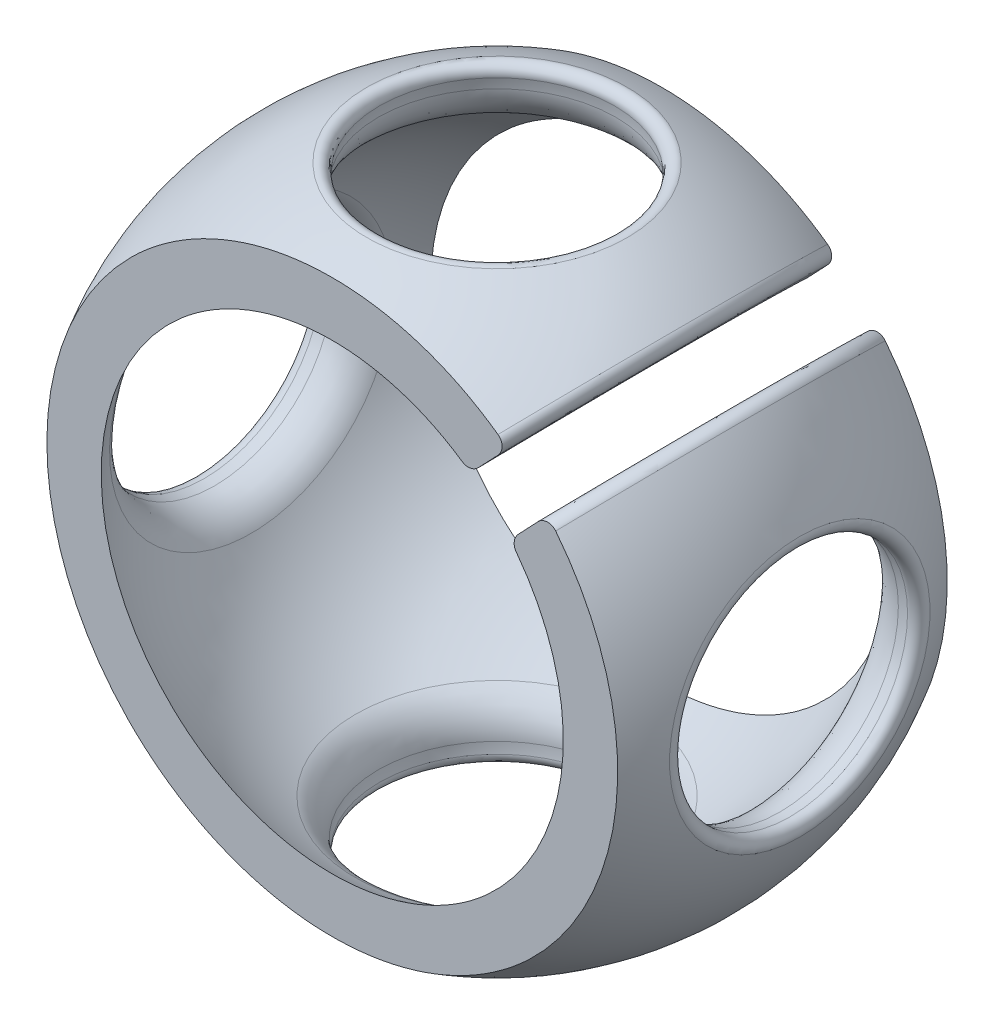
ISO-10303-21;
HEADER;
FILE_DESCRIPTION(('STEP AP214'),'2;1');
FILE_NAME('part.step','',(''),(''),'','','');
FILE_SCHEMA(('AUTOMOTIVE_DESIGN { 1 0 10303 214 1 1 1 1 }'));
ENDSEC;
DATA;
#1=APPLICATION_CONTEXT('core data for automotive mechanical design processes');
#2=APPLICATION_PROTOCOL_DEFINITION('international standard','automotive_design',2000,#1);
#3=PRODUCT_CONTEXT('',#1,'mechanical');
#4=PRODUCT('Part','Part','',(#3));
#5=PRODUCT_RELATED_PRODUCT_CATEGORY('part','',(#4));
#6=PRODUCT_DEFINITION_FORMATION('','',#4);
#7=PRODUCT_DEFINITION_CONTEXT('part definition',#1,'design');
#8=PRODUCT_DEFINITION('design','',#6,#7);
#9=PRODUCT_DEFINITION_SHAPE('','',#8);
#10=(LENGTH_UNIT() NAMED_UNIT(*) SI_UNIT(.MILLI.,.METRE.));
#11=(NAMED_UNIT(*) PLANE_ANGLE_UNIT() SI_UNIT($,.RADIAN.));
#12=(NAMED_UNIT(*) SI_UNIT($,.STERADIAN.) SOLID_ANGLE_UNIT());
#13=UNCERTAINTY_MEASURE_WITH_UNIT(LENGTH_MEASURE(1.E-05),#10,'distance_accuracy_value','');
#14=(GEOMETRIC_REPRESENTATION_CONTEXT(3) GLOBAL_UNCERTAINTY_ASSIGNED_CONTEXT((#13)) GLOBAL_UNIT_ASSIGNED_CONTEXT((#10,
#11,#12)) REPRESENTATION_CONTEXT('',''));
#15=CARTESIAN_POINT('',(0.,0.,0.));
#16=DIRECTION('',(0.,0.,1.));
#17=DIRECTION('',(1.,0.,0.));
#18=AXIS2_PLACEMENT_3D('',#15,#16,#17);
#19=CARTESIAN_POINT('',(0.,0.,0.));
#20=DIRECTION('',(0.,1.,0.));
#21=DIRECTION('',(1.,0.,0.));
#22=AXIS2_PLACEMENT_3D('',#19,#20,#21);
#23=SPHERICAL_SURFACE('',#22,7.75);
#24=CARTESIAN_POINT('',(6.71666666666667,0.,0.));
#25=DIRECTION('',(-1.,0.,0.));
#26=DIRECTION('',(0.,-1.,0.));
#27=AXIS2_PLACEMENT_3D('',#24,#25,#26);
#28=CIRCLE('',#27,3.86637929966641);
#29=CARTESIAN_POINT('',(6.71666666666667,-3.86637929966641,0.));
#30=VERTEX_POINT('',#29);
#31=EDGE_CURVE('E248',#30,#30,#28,.F.);
#32=ORIENTED_EDGE('',*,*,#31,.T.);
#33=EDGE_LOOP('',(#32));
#34=FACE_BOUND('',#33,.T.);
#35=CARTESIAN_POINT('',(-6.71666666666667,0.,0.));
#36=DIRECTION('',(1.,0.,0.));
#37=DIRECTION('',(0.,1.,0.));
#38=AXIS2_PLACEMENT_3D('',#35,#36,#37);
#39=CIRCLE('',#38,3.86637929966641);
#40=CARTESIAN_POINT('',(-6.71666666666667,3.86637929966641,0.));
#41=VERTEX_POINT('',#40);
#42=EDGE_CURVE('E244',#41,#41,#39,.F.);
#43=ORIENTED_EDGE('',*,*,#42,.T.);
#44=EDGE_LOOP('',(#43));
#45=FACE_BOUND('',#44,.T.);
#46=CARTESIAN_POINT('',(0.,-6.71666666666667,0.));
#47=DIRECTION('',(0.,1.,0.));
#48=DIRECTION('',(-1.,0.,0.));
#49=AXIS2_PLACEMENT_3D('',#46,#47,#48);
#50=CIRCLE('',#49,3.86637929966641);
#51=CARTESIAN_POINT('',(-3.86637929966641,-6.71666666666667,0.));
#52=VERTEX_POINT('',#51);
#53=EDGE_CURVE('E240',#52,#52,#50,.F.);
#54=ORIENTED_EDGE('',*,*,#53,.T.);
#55=EDGE_LOOP('',(#54));
#56=FACE_BOUND('',#55,.T.);
#57=CARTESIAN_POINT('',(0.,6.71666666666667,0.));
#58=DIRECTION('',(0.,-1.,0.));
#59=DIRECTION('',(1.,0.,0.));
#60=AXIS2_PLACEMENT_3D('',#57,#58,#59);
#61=CIRCLE('',#60,3.86637929966641);
#62=CARTESIAN_POINT('',(3.86637929966641,6.71666666666667,0.));
#63=VERTEX_POINT('',#62);
#64=EDGE_CURVE('E236',#63,#63,#61,.F.);
#65=ORIENTED_EDGE('',*,*,#64,.T.);
#66=EDGE_LOOP('',(#65));
#67=FACE_BOUND('',#66,.T.);
#68=CARTESIAN_POINT('',(0.,0.,4.5));
#69=DIRECTION('',(0.,0.,1.));
#70=DIRECTION('',(1.,0.,0.));
#71=AXIS2_PLACEMENT_3D('',#68,#69,#70);
#72=CIRCLE('',#71,6.30971473206198);
#73=CARTESIAN_POINT('',(5.02078799919602,3.82154260307657,4.5));
#74=VERTEX_POINT('',#73);
#75=CARTESIAN_POINT('',(3.55438310296655,5.21333489786968,4.5));
#76=VERTEX_POINT('',#75);
#77=EDGE_CURVE('E124',#74,#76,#72,.F.);
#78=ORIENTED_EDGE('',*,*,#77,.F.);
#79=CARTESIAN_POINT('',(0.733202448114739,-0.69589614739656,0.));
#80=DIRECTION('',(-0.725318550823175,0.688413393123471,0.));
#81=DIRECTION('',(-0.688413393123471,-0.725318550823175,0.));
#82=AXIS2_PLACEMENT_3D('',#79,#80,#81);
#83=CIRCLE('',#82,7.6837909082768);
#84=CARTESIAN_POINT('',(5.02078799919602,3.82154260307657,-4.5));
#85=VERTEX_POINT('',#84);
#86=EDGE_CURVE('E138',#74,#85,#83,.T.);
#87=ORIENTED_EDGE('',*,*,#86,.T.);
#88=CARTESIAN_POINT('',(0.,0.,-4.5));
#89=DIRECTION('',(0.,0.,1.));
#90=DIRECTION('',(1.,0.,0.));
#91=AXIS2_PLACEMENT_3D('',#88,#89,#90);
#92=CIRCLE('',#91,6.30971473206198);
#93=CARTESIAN_POINT('',(3.55438310296655,5.21333489786968,-4.5));
#94=VERTEX_POINT('',#93);
#95=EDGE_CURVE('E143',#85,#94,#92,.F.);
#96=ORIENTED_EDGE('',*,*,#95,.T.);
#97=CARTESIAN_POINT('',(-0.733202448114734,0.695896147396554,0.));
#98=DIRECTION('',(0.725318550823175,-0.688413393123471,0.));
#99=DIRECTION('',(0.688413393123471,0.725318550823175,0.));
#100=AXIS2_PLACEMENT_3D('',#97,#98,#99);
#101=CIRCLE('',#100,7.6837909082768);
#102=EDGE_CURVE('E141',#94,#76,#101,.T.);
#103=ORIENTED_EDGE('',*,*,#102,.T.);
#104=EDGE_LOOP('',(#78,#87,#96,#103));
#105=FACE_BOUND('',#104,.T.);
#106=ADVANCED_FACE('F55',(#34,#45,#56,#67,#105),#23,.F.);
#107=CARTESIAN_POINT('',(0.,0.,0.));
#108=DIRECTION('',(0.,1.,0.));
#109=DIRECTION('',(1.,0.,0.));
#110=AXIS2_PLACEMENT_3D('',#107,#108,#109);
#111=SPHERICAL_SURFACE('',#110,9.);
#112=CARTESIAN_POINT('',(0.,8.26714285714286,0.));
#113=DIRECTION('',(0.,-1.,0.));
#114=DIRECTION('',(1.,0.,0.));
#115=AXIS2_PLACEMENT_3D('',#112,#113,#114);
#116=CIRCLE('',#115,3.55729517746164);
#117=CARTESIAN_POINT('',(3.55729517746164,8.26714285714286,0.));
#118=VERTEX_POINT('',#117);
#119=EDGE_CURVE('E404',#118,#118,#116,.T.);
#120=ORIENTED_EDGE('',*,*,#119,.T.);
#121=EDGE_LOOP('',(#120));
#122=FACE_BOUND('',#121,.T.);
#123=CARTESIAN_POINT('',(-8.26714285714286,0.,0.));
#124=DIRECTION('',(1.,0.,0.));
#125=DIRECTION('',(0.,1.,0.));
#126=AXIS2_PLACEMENT_3D('',#123,#124,#125);
#127=CIRCLE('',#126,3.55729517746164);
#128=CARTESIAN_POINT('',(-8.26714285714286,3.55729517746164,0.));
#129=VERTEX_POINT('',#128);
#130=EDGE_CURVE('E409',#129,#129,#127,.T.);
#131=ORIENTED_EDGE('',*,*,#130,.T.);
#132=EDGE_LOOP('',(#131));
#133=FACE_BOUND('',#132,.T.);
#134=CARTESIAN_POINT('',(0.,-8.26714285714286,0.));
#135=DIRECTION('',(0.,1.,0.));
#136=DIRECTION('',(-1.,0.,0.));
#137=AXIS2_PLACEMENT_3D('',#134,#135,#136);
#138=CIRCLE('',#137,3.55729517746164);
#139=CARTESIAN_POINT('',(-3.55729517746164,-8.26714285714286,0.));
#140=VERTEX_POINT('',#139);
#141=EDGE_CURVE('E386',#140,#140,#138,.T.);
#142=ORIENTED_EDGE('',*,*,#141,.T.);
#143=EDGE_LOOP('',(#142));
#144=FACE_BOUND('',#143,.T.);
#145=CARTESIAN_POINT('',(8.26714285714286,0.,0.));
#146=DIRECTION('',(-1.,0.,0.));
#147=DIRECTION('',(0.,-1.,0.));
#148=AXIS2_PLACEMENT_3D('',#145,#146,#147);
#149=CIRCLE('',#148,3.55729517746164);
#150=CARTESIAN_POINT('',(8.26714285714286,-3.55729517746165,0.));
#151=VERTEX_POINT('',#150);
#152=EDGE_CURVE('E382',#151,#151,#149,.T.);
#153=ORIENTED_EDGE('',*,*,#152,.T.);
#154=EDGE_LOOP('',(#153));
#155=FACE_BOUND('',#154,.T.);
#156=CARTESIAN_POINT('',(0.,0.,4.5));
#157=DIRECTION('',(0.,0.,1.));
#158=DIRECTION('',(1.,0.,0.));
#159=AXIS2_PLACEMENT_3D('',#156,#157,#158);
#160=CIRCLE('',#159,7.79422863405995);
#161=CARTESIAN_POINT('',(6.10113789721775,4.85037280620093,4.5));
#162=VERTEX_POINT('',#161);
#163=CARTESIAN_POINT('',(4.52544587301567,6.34589155677951,4.5));
#164=VERTEX_POINT('',#163);
#165=EDGE_CURVE('E334',#162,#164,#160,.F.);
#166=ORIENTED_EDGE('',*,*,#165,.T.);
#167=CARTESIAN_POINT('',(-0.787846012101037,0.747759375289289,0.));
#168=DIRECTION('',(0.725318550823175,-0.688413393123471,0.));
#169=DIRECTION('',(0.688413393123471,0.725318550823175,0.));
#170=AXIS2_PLACEMENT_3D('',#167,#168,#169);
#171=CIRCLE('',#170,8.93421258857677);
#172=CARTESIAN_POINT('',(4.52544587301567,6.34589155677951,-4.5));
#173=VERTEX_POINT('',#172);
#174=EDGE_CURVE('E227',#164,#173,#171,.F.);
#175=ORIENTED_EDGE('',*,*,#174,.T.);
#176=CARTESIAN_POINT('',(0.,0.,-4.5));
#177=DIRECTION('',(0.,0.,1.));
#178=DIRECTION('',(1.,0.,0.));
#179=AXIS2_PLACEMENT_3D('',#176,#177,#178);
#180=CIRCLE('',#179,7.79422863405995);
#181=CARTESIAN_POINT('',(6.10113789721775,4.85037280620093,-4.5));
#182=VERTEX_POINT('',#181);
#183=EDGE_CURVE('E387',#182,#173,#180,.F.);
#184=ORIENTED_EDGE('',*,*,#183,.F.);
#185=CARTESIAN_POINT('',(0.787846012101043,-0.747759375289296,0.));
#186=DIRECTION('',(-0.725318550823175,0.688413393123471,0.));
#187=DIRECTION('',(-0.688413393123471,-0.725318550823175,0.));
#188=AXIS2_PLACEMENT_3D('',#185,#186,#187);
#189=CIRCLE('',#188,8.93421258857676);
#190=EDGE_CURVE('E131',#182,#162,#189,.F.);
#191=ORIENTED_EDGE('',*,*,#190,.T.);
#192=EDGE_LOOP('',(#166,#175,#184,#191));
#193=FACE_BOUND('',#192,.T.);
#194=ADVANCED_FACE('F176',(#122,#133,#144,#155,#193),#111,.T.);
#195=CARTESIAN_POINT('',(0.,12.5,-4.5));
#196=DIRECTION('',(0.,0.,1.));
#197=DIRECTION('',(1.,0.,0.));
#198=AXIS2_PLACEMENT_3D('',#195,#196,#197);
#199=PLANE('',#198);
#200=ORIENTED_EDGE('',*,*,#95,.F.);
#201=CARTESIAN_POINT('',(5.02078799919602,3.82154260307657,-4.5));
#202=CARTESIAN_POINT('',(5.01140973893834,3.83382565129379,-4.5));
#203=CARTESIAN_POINT('',(5.00324758314674,3.84698347736219,-4.5));
#204=CARTESIAN_POINT('',(4.98942289250893,3.87444683945307,-4.5));
#205=CARTESIAN_POINT('',(4.98374375472272,3.88874397210675,-4.5));
#206=CARTESIAN_POINT('',(4.97483744968509,3.91802274792431,-4.5));
#207=CARTESIAN_POINT('',(4.9716033004275,3.93300231143106,-4.5));
#208=CARTESIAN_POINT('',(4.96742121120854,3.96329200411203,-4.5));
#209=CARTESIAN_POINT('',(4.9664771071772,3.97860264464612,-4.5));
#210=CARTESIAN_POINT('',(4.96672483887115,4.01083209912858,-4.5));
#211=CARTESIAN_POINT('',(4.96815479689111,4.0277485713737,-4.5));
#212=CARTESIAN_POINT('',(4.97335889646006,4.06120993198714,-4.5));
#213=CARTESIAN_POINT('',(4.97713387948087,4.07775468476121,-4.5));
#214=CARTESIAN_POINT('',(4.98772117287576,4.1133323470014,-4.5));
#215=CARTESIAN_POINT('',(4.99497733161192,4.1322334599741,-4.5));
#216=CARTESIAN_POINT('',(5.012130094073,4.16878648782942,-4.5));
#217=CARTESIAN_POINT('',(5.0220274199803,4.18643805937332,-4.5));
#218=CARTESIAN_POINT('',(5.04745028260876,4.22518489837198,-4.5));
#219=CARTESIAN_POINT('',(5.06377484594357,4.24576056470473,-4.5));
#220=CARTESIAN_POINT('',(5.08177690317263,4.26474424864854,-4.5));
#221=B_SPLINE_CURVE_WITH_KNOTS('',3,(#201,#202,#203,#204,#205,#206,#207,#208,#209,#210,#211,
#212,#213,#214,#215,#216,#217,#218,#219,#220),.UNSPECIFIED.,.F.,.F.,(4,2,2,2,2,2,2,2,2,4),(0.,
0.0462303776808788,0.0921467190567898,0.137931439397152,0.18379279842972,0.234537145030331,
0.285299710892259,0.345803654542203,0.406324158951382,0.484692683883423),.UNSPECIFIED.);
#222=CARTESIAN_POINT('',(5.08177690317272,4.26474424864848,-4.5));
#223=VERTEX_POINT('',#222);
#224=EDGE_CURVE('E146',#85,#223,#221,.T.);
#225=ORIENTED_EDGE('',*,*,#224,.T.);
#226=DIRECTION('',(0.688413393123471,0.725318550823175,0.));
#227=VECTOR('',#226,1.);
#228=CARTESIAN_POINT('',(6.78547647146214,6.05977745726027,-4.5));
#229=LINE('',#228,#227);
#230=CARTESIAN_POINT('',(5.61855762664948,4.83030125313307,-4.5));
#231=VERTEX_POINT('',#230);
#232=EDGE_CURVE('E329',#223,#231,#229,.T.);
#233=ORIENTED_EDGE('',*,*,#232,.T.);
#234=CARTESIAN_POINT('',(5.61855762664948,4.83030125313307,-4.5));
#235=CARTESIAN_POINT('',(5.63610139294097,4.84879702015645,-4.5));
#236=CARTESIAN_POINT('',(5.65540979968482,4.86568829064156,-4.5));
#237=CARTESIAN_POINT('',(5.69701789545886,4.89561512617583,-4.5));
#238=CARTESIAN_POINT('',(5.71933804280176,4.90862217225791,-4.5));
#239=CARTESIAN_POINT('',(5.76330264369263,4.92855124263948,-4.5));
#240=CARTESIAN_POINT('',(5.78469700526391,4.93602223395943,-4.5));
#241=CARTESIAN_POINT('',(5.82847282206717,4.94668029731862,-4.5));
#242=CARTESIAN_POINT('',(5.85084989437941,4.94988472134227,-4.5));
#243=CARTESIAN_POINT('',(5.88981862921563,4.95130578670816,-4.5));
#244=CARTESIAN_POINT('',(5.90637350862195,4.95061833940586,-4.5));
#245=CARTESIAN_POINT('',(5.93915221025394,4.94650313274995,-4.5));
#246=CARTESIAN_POINT('',(5.95537607477731,4.94307572579124,-4.5));
#247=CARTESIAN_POINT('',(5.98705166235491,4.9333832635681,-4.5));
#248=CARTESIAN_POINT('',(6.0024989930755,4.92710372857028,-4.5));
#249=CARTESIAN_POINT('',(6.03195161007087,4.91177721542311,-4.5));
#250=CARTESIAN_POINT('',(6.04595843702096,4.90273323597383,-4.5));
#251=CARTESIAN_POINT('',(6.06677530552557,4.88627110860097,-4.5));
#252=CARTESIAN_POINT('',(6.07422535961328,4.87964631571378,-4.5));
#253=CARTESIAN_POINT('',(6.08831131977474,4.86559219046276,-4.5));
#254=CARTESIAN_POINT('',(6.09494788112451,4.85816351483813,-4.5));
#255=CARTESIAN_POINT('',(6.10113789721868,4.85037280620211,-4.5));
#256=B_SPLINE_CURVE_WITH_KNOTS('',3,(#234,#235,#236,#237,#238,#239,#240,#241,#242,#243,#244,
#245,#246,#247,#248,#249,#250,#251,#252,#253,#254,#255),.UNSPECIFIED.,.F.,.F.,(4,2,2,2,2,2,2,2,
2,2,4),(0.,0.0764556199619205,0.153459523688465,0.221063891462657,0.288392466092669,
0.337895755955597,0.387392680067399,0.437143749407346,0.486841042206323,0.51668911828632,
0.546512991222408),.UNSPECIFIED.);
#257=EDGE_CURVE('E152',#231,#182,#256,.T.);
#258=ORIENTED_EDGE('',*,*,#257,.T.);
#259=ORIENTED_EDGE('',*,*,#183,.T.);
#260=CARTESIAN_POINT('',(4.52544587301567,6.34589155677951,-4.5));
#261=CARTESIAN_POINT('',(4.53758830535816,6.33726074613841,-4.5));
#262=CARTESIAN_POINT('',(4.5489582350627,6.32755971964251,-4.5));
#263=CARTESIAN_POINT('',(4.56984652756651,6.3063961841416,-4.5));
#264=CARTESIAN_POINT('',(4.57937076847616,6.29493948252598,-4.5));
#265=CARTESIAN_POINT('',(4.59634362986764,6.2705826703584,-4.5));
#266=CARTESIAN_POINT('',(4.60379216671889,6.25768250167817,-4.5));
#267=CARTESIAN_POINT('',(4.61648807033916,6.23084176185755,-4.5));
#268=CARTESIAN_POINT('',(4.62173457314135,6.21690078487868,-4.5));
#269=CARTESIAN_POINT('',(4.6301177192934,6.18796190357395,-4.5));
#270=CARTESIAN_POINT('',(4.63318836512399,6.17294503203687,-4.5));
#271=CARTESIAN_POINT('',(4.63703520924515,6.14262322408635,-4.5));
#272=CARTESIAN_POINT('',(4.63781049597587,6.12731817565629,-4.5));
#273=CARTESIAN_POINT('',(4.63715611967412,6.09506167545313,-4.5));
#274=CARTESIAN_POINT('',(4.63547276350311,6.07811559899165,-4.5));
#275=CARTESIAN_POINT('',(4.6296436257965,6.04465403226486,-4.5));
#276=CARTESIAN_POINT('',(4.62549640316835,6.02813879990235,-4.5));
#277=CARTESIAN_POINT('',(4.61423304603089,5.99359254800976,-4.5));
#278=CARTESIAN_POINT('',(4.60678437574692,5.97566990033261,-4.5));
#279=CARTESIAN_POINT('',(4.5893187184804,5.9411389265409,-4.5));
#280=CARTESIAN_POINT('',(4.579302068459,5.92453042836222,-4.5));
#281=CARTESIAN_POINT('',(4.55675823794317,5.89256977134936,-4.5));
#282=CARTESIAN_POINT('',(4.54418152272007,5.87725247991584,-4.5));
#283=CARTESIAN_POINT('',(4.53057980041472,5.86292134281828,-4.5));
#284=B_SPLINE_CURVE_WITH_KNOTS('',3,(#260,#261,#262,#263,#264,#265,#266,#267,#268,#269,#270,
#271,#272,#273,#274,#275,#276,#277,#278,#279,#280,#281,#282,#283),.UNSPECIFIED.,.F.,.F.,(4,2,2,
2,2,2,2,2,2,2,2,4),(0.,0.044622693940159,0.089100850746023,0.133580799328006,0.178078183316132,
0.223873348383374,0.269686697724213,0.320573598396803,0.37149029168633,0.429483999123018,
0.487470100723604,0.546708161821188),.UNSPECIFIED.);
#285=CARTESIAN_POINT('',(4.53057980041472,5.86292134281828,-4.5));
#286=VERTEX_POINT('',#285);
#287=EDGE_CURVE('E185',#173,#286,#284,.T.);
#288=ORIENTED_EDGE('',*,*,#287,.T.);
#289=DIRECTION('',(0.688413393123471,0.725318550823175,0.));
#290=VECTOR('',#289,1.);
#291=CARTESIAN_POINT('',(5.69749864522737,7.09239754694548,-4.5));
#292=LINE('',#291,#290);
#293=CARTESIAN_POINT('',(3.99379907693795,5.2973643383337,-4.5));
#294=VERTEX_POINT('',#293);
#295=EDGE_CURVE('E325',#294,#286,#292,.T.);
#296=ORIENTED_EDGE('',*,*,#295,.F.);
#297=CARTESIAN_POINT('',(3.99379907693795,5.2973643383337,-4.5));
#298=CARTESIAN_POINT('',(3.97631973924627,5.27895798461094,-4.5));
#299=CARTESIAN_POINT('',(3.95723437077738,5.26203449821417,-4.5));
#300=CARTESIAN_POINT('',(3.91622467504196,5.23162449231003,-4.5));
#301=CARTESIAN_POINT('',(3.89427551479721,5.21817152323314,-4.5));
#302=CARTESIAN_POINT('',(3.84930272467741,5.19605420065193,-4.5));
#303=CARTESIAN_POINT('',(3.82637306105487,5.18720023715853,-4.5));
#304=CARTESIAN_POINT('',(3.77928025405633,5.17411593490031,-4.5));
#305=CARTESIAN_POINT('',(3.75512264493983,5.16986649536357,-4.5));
#306=CARTESIAN_POINT('',(3.71429921965369,5.16723590289724,-4.5));
#307=CARTESIAN_POINT('',(3.69772247235122,5.16740705635197,-4.5));
#308=CARTESIAN_POINT('',(3.66483713088713,5.17045480504445,-4.5));
#309=CARTESIAN_POINT('',(3.64852799957716,5.17332506239556,-4.5));
#310=CARTESIAN_POINT('',(3.61874862002634,5.18138382388873,-4.5));
#311=CARTESIAN_POINT('',(3.60518465257177,5.18622308134546,-4.5));
#312=CARTESIAN_POINT('',(3.57896806912183,5.1981117478371,-4.5));
#313=CARTESIAN_POINT('',(3.5663214938427,5.20517441228225,-4.5));
#314=CARTESIAN_POINT('',(3.55438310296655,5.21333489786968,-4.5));
#315=B_SPLINE_CURVE_WITH_KNOTS('',3,(#297,#298,#299,#300,#301,#302,#303,#304,#305,#306,#307,
#308,#309,#310,#311,#312,#313,#314),.UNSPECIFIED.,.F.,.F.,(4,2,2,2,2,2,2,2,4),(0.,
0.0761098555008376,0.152930026032431,0.226263948414116,0.299292483900605,0.348836031056511,
0.398263532520454,0.441275666332191,0.484549245511569),.UNSPECIFIED.);
#316=EDGE_CURVE('E148',#294,#94,#315,.T.);
#317=ORIENTED_EDGE('',*,*,#316,.T.);
#318=EDGE_LOOP('',(#200,#225,#233,#258,#259,#288,#296,#317));
#319=FACE_BOUND('',#318,.T.);
#320=ADVANCED_FACE('F171',(#319),#199,.F.);
#321=CARTESIAN_POINT('',(0.,12.5,4.5));
#322=DIRECTION('',(0.,0.,1.));
#323=DIRECTION('',(1.,0.,0.));
#324=AXIS2_PLACEMENT_3D('',#321,#322,#323);
#325=PLANE('',#324);
#326=DIRECTION('',(0.688413393123471,0.725318550823174,0.));
#327=VECTOR('',#326,1.);
#328=CARTESIAN_POINT('',(9.167533971189,8.56953469170367,4.5));
#329=LINE('',#328,#327);
#330=CARTESIAN_POINT('',(5.08177690317272,4.26474424864848,4.5));
#331=VERTEX_POINT('',#330);
#332=CARTESIAN_POINT('',(5.61855762664948,4.83030125313307,4.5));
#333=VERTEX_POINT('',#332);
#334=EDGE_CURVE('E126',#331,#333,#329,.T.);
#335=ORIENTED_EDGE('',*,*,#334,.F.);
#336=CARTESIAN_POINT('',(5.08177690317272,4.26474424864848,4.49999999999999));
#337=CARTESIAN_POINT('',(5.06430758570252,4.24632838454623,4.5));
#338=CARTESIAN_POINT('',(5.04840290895715,4.22638604418608,4.5));
#339=CARTESIAN_POINT('',(5.02017396107627,4.18384559161514,4.5));
#340=CARTESIAN_POINT('',(5.00788449031167,4.16122443070861,4.5));
#341=CARTESIAN_POINT('',(4.98814370168419,4.11515894391333,4.5));
#342=CARTESIAN_POINT('',(4.98049812948397,4.09179856358431,4.5));
#343=CARTESIAN_POINT('',(4.96988866805146,4.04408723615885,4.5));
#344=CARTESIAN_POINT('',(4.96690541531788,4.01974081922064,4.5));
#345=CARTESIAN_POINT('',(4.96640832709855,3.97883574652642,4.5));
#346=CARTESIAN_POINT('',(4.96744412266321,3.96229050635944,4.5));
#347=CARTESIAN_POINT('',(4.97220348016704,3.92960896766473,4.5));
#348=CARTESIAN_POINT('',(4.97592074087688,3.91347180204737,4.5));
#349=CARTESIAN_POINT('',(4.98552223577082,3.88415343955835,4.5));
#350=CARTESIAN_POINT('',(4.99106258864661,3.87086042952101,4.5));
#351=CARTESIAN_POINT('',(5.00430288691921,3.84529983210253,4.5));
#352=CARTESIAN_POINT('',(5.0120157545042,3.83303896879801,4.5));
#353=CARTESIAN_POINT('',(5.02078799919602,3.82154260307657,4.5));
#354=B_SPLINE_CURVE_WITH_KNOTS('',3,(#336,#337,#338,#339,#340,#341,#342,#343,#344,#345,#346,
#347,#348,#349,#350,#351,#352,#353),.UNSPECIFIED.,.F.,.F.,(4,2,2,2,2,2,2,2,4),(0.,
0.0761098555008367,0.152930026032432,0.226263948414117,0.299292483900607,0.348836031056511,
0.398263532520455,0.441275666332192,0.48454924551157),.UNSPECIFIED.);
#355=EDGE_CURVE('E121',#331,#74,#354,.T.);
#356=ORIENTED_EDGE('',*,*,#355,.T.);
#357=ORIENTED_EDGE('',*,*,#77,.T.);
#358=CARTESIAN_POINT('',(3.55438310296655,5.21333489786968,4.50000000000001));
#359=CARTESIAN_POINT('',(3.5671387231406,5.20461026647675,4.5));
#360=CARTESIAN_POINT('',(3.58070448069175,5.19714572388686,4.5));
#361=CARTESIAN_POINT('',(3.60885172735382,5.18477273581161,4.5));
#362=CARTESIAN_POINT('',(3.62342569078306,5.17984727156193,4.5));
#363=CARTESIAN_POINT('',(3.65312926674331,5.17248068768798,4.5));
#364=CARTESIAN_POINT('',(3.66825716672885,5.17003248706293,4.5));
#365=CARTESIAN_POINT('',(3.69872380145546,5.16743642824657,4.5));
#366=CARTESIAN_POINT('',(3.71406284672412,5.16729242744049,4.5));
#367=CARTESIAN_POINT('',(3.74623547983697,5.1692213612952,4.5));
#368=CARTESIAN_POINT('',(3.76305430537459,5.17153197175429,4.5));
#369=CARTESIAN_POINT('',(3.79619857323458,5.1784747964281,4.5));
#370=CARTESIAN_POINT('',(3.81252383624442,5.18310784389409,4.5));
#371=CARTESIAN_POINT('',(3.84750066059162,5.1955369464559,4.5));
#372=CARTESIAN_POINT('',(3.86599744759656,5.20376936904619,4.5));
#373=CARTESIAN_POINT('',(3.90160576233474,5.22280588729255,4.5));
#374=CARTESIAN_POINT('',(3.91871690951776,5.23361068623403,4.5));
#375=CARTESIAN_POINT('',(3.95608456324009,5.26102050075187,4.5));
#376=CARTESIAN_POINT('',(3.97578048793445,5.27839634500597,4.5));
#377=CARTESIAN_POINT('',(3.99379907693802,5.29736433833361,4.5));
#378=B_SPLINE_CURVE_WITH_KNOTS('',3,(#358,#359,#360,#361,#362,#363,#364,#365,#366,#367,#368,
#369,#370,#371,#372,#373,#374,#375,#376,#377),.UNSPECIFIED.,.F.,.F.,(4,2,2,2,2,2,2,2,2,4),(0.,
0.0462303776808782,0.0921467190567897,0.137931439397151,0.18379279842972,0.23453714503033,
0.285299710892258,0.345803654542202,0.406324158951383,0.484692683883426),.UNSPECIFIED.);
#379=CARTESIAN_POINT('',(3.99379907693795,5.2973643383337,4.5));
#380=VERTEX_POINT('',#379);
#381=EDGE_CURVE('E78',#76,#380,#378,.T.);
#382=ORIENTED_EDGE('',*,*,#381,.T.);
#383=DIRECTION('',(0.688413393123471,0.725318550823174,0.));
#384=VECTOR('',#383,1.);
#385=CARTESIAN_POINT('',(8.07955614495423,9.60215478138888,4.5));
#386=LINE('',#385,#384);
#387=CARTESIAN_POINT('',(4.53057980041472,5.86292134281829,4.5));
#388=VERTEX_POINT('',#387);
#389=EDGE_CURVE('E301',#380,#388,#386,.T.);
#390=ORIENTED_EDGE('',*,*,#389,.T.);
#391=CARTESIAN_POINT('',(4.53057980041472,5.86292134281829,4.49999999999999));
#392=CARTESIAN_POINT('',(4.54813504790768,5.88140621281876,4.5));
#393=CARTESIAN_POINT('',(4.56399591582012,5.90156960684485,4.5));
#394=CARTESIAN_POINT('',(4.59171113048085,5.94468243550809,4.5));
#395=CARTESIAN_POINT('',(4.60353592971261,5.96765081264533,4.5));
#396=CARTESIAN_POINT('',(4.62114404778468,6.01259531348501,4.5));
#397=CARTESIAN_POINT('',(4.62748863425638,6.03435032763918,4.5));
#398=CARTESIAN_POINT('',(4.63584822195215,6.0786225959899,4.5));
#399=CARTESIAN_POINT('',(4.63788078020184,6.10113637855863,4.5));
#400=CARTESIAN_POINT('',(4.63726675530552,6.14012618100666,4.5));
#401=CARTESIAN_POINT('',(4.63571651001632,6.156622645946,4.5));
#402=CARTESIAN_POINT('',(4.62989671224347,6.1891419964989,4.5));
#403=CARTESIAN_POINT('',(4.62562750946794,6.20516494273843,4.5));
#404=CARTESIAN_POINT('',(4.61429560617094,6.23629169393415,4.5));
#405=CARTESIAN_POINT('',(4.60721867480295,6.25139035707342,4.5));
#406=CARTESIAN_POINT('',(4.59037637537458,6.28000321437729,4.5));
#407=CARTESIAN_POINT('',(4.58061392154689,6.29351910357299,4.5));
#408=CARTESIAN_POINT('',(4.56308811613346,6.31344872465794,4.5));
#409=CARTESIAN_POINT('',(4.55608364702786,6.32054298989521,4.5));
#410=CARTESIAN_POINT('',(4.54131374247403,6.33387650517485,4.5));
#411=CARTESIAN_POINT('',(4.53354892868216,6.34011644386547,4.5));
#412=CARTESIAN_POINT('',(4.5254458730168,6.34589155678051,4.5));
#413=B_SPLINE_CURVE_WITH_KNOTS('',3,(#391,#392,#393,#394,#395,#396,#397,#398,#399,#400,#401,
#402,#403,#404,#405,#406,#407,#408,#409,#410,#411,#412),.UNSPECIFIED.,.F.,.F.,(4,2,2,2,2,2,2,2,
2,2,4),(0.,0.0764556199619202,0.153459523688465,0.221063891462656,0.288392466092667,
0.337895755955597,0.387392680067399,0.437143749407345,0.486841042206326,0.516689118286319,
0.546512991222403),.UNSPECIFIED.);
#414=EDGE_CURVE('E132',#388,#164,#413,.T.);
#415=ORIENTED_EDGE('',*,*,#414,.T.);
#416=ORIENTED_EDGE('',*,*,#165,.F.);
#417=CARTESIAN_POINT('',(6.10113789721775,4.85037280620093,4.5));
#418=CARTESIAN_POINT('',(6.09188532239105,4.86204839674663,4.5));
#419=CARTESIAN_POINT('',(6.08160429388644,4.87289669935339,4.5));
#420=CARTESIAN_POINT('',(6.0593797571432,4.89265235588946,4.5));
#421=CARTESIAN_POINT('',(6.0474417416998,4.90156588291795,4.5));
#422=CARTESIAN_POINT('',(6.02223256120707,4.91724483510444,4.5));
#423=CARTESIAN_POINT('',(6.00896134247198,4.92401017371296,4.5));
#424=CARTESIAN_POINT('',(5.98149476340867,4.93528839686259,4.5));
#425=CARTESIAN_POINT('',(5.96729904287134,4.93980039743936,4.5));
#426=CARTESIAN_POINT('',(5.93796219378264,4.94666226862167,4.5));
#427=CARTESIAN_POINT('',(5.9228055672078,4.94894524200068,4.5));
#428=CARTESIAN_POINT('',(5.89232435203019,4.95120483673785,4.5));
#429=CARTESIAN_POINT('',(5.87699969912307,4.95118054193334,4.5));
#430=CARTESIAN_POINT('',(5.84482127340145,4.94884410623354,4.5));
#431=CARTESIAN_POINT('',(5.82798610476335,4.94627889817892,4.5));
#432=CARTESIAN_POINT('',(5.79487424181074,4.93871187590979,4.5));
#433=CARTESIAN_POINT('',(5.77859788023532,4.93370863602131,4.5));
#434=CARTESIAN_POINT('',(5.7446863344144,4.92065820331325,4.5));
#435=CARTESIAN_POINT('',(5.72717672414198,4.91228458182274,4.5));
#436=CARTESIAN_POINT('',(5.69360403442232,4.89304109358015,4.5));
#437=CARTESIAN_POINT('',(5.6775407655647,4.88217155435301,4.5));
#438=CARTESIAN_POINT('',(5.64679984048926,4.85799091299415,4.5));
#439=CARTESIAN_POINT('',(5.63215958860797,4.84463216277137,4.5));
#440=CARTESIAN_POINT('',(5.61855762664948,4.83030125313308,4.5));
#441=B_SPLINE_CURVE_WITH_KNOTS('',3,(#417,#418,#419,#420,#421,#422,#423,#424,#425,#426,#427,
#428,#429,#430,#431,#432,#433,#434,#435,#436,#437,#438,#439,#440),.UNSPECIFIED.,.F.,.F.,(4,2,2,
2,2,2,2,2,2,2,2,4),(0.,0.0446226939401596,0.089100850746024,0.133580799328008,0.178078183316135,
0.223873348383375,0.269686697724214,0.320573598396803,0.37149029168633,0.429483999123018,
0.487470100723603,0.546708161821184),.UNSPECIFIED.);
#442=EDGE_CURVE('E213',#162,#333,#441,.T.);
#443=ORIENTED_EDGE('',*,*,#442,.T.);
#444=EDGE_LOOP('',(#335,#356,#357,#382,#390,#415,#416,#443));
#445=FACE_BOUND('',#444,.T.);
#446=ADVANCED_FACE('F123',(#445),#325,.T.);
#447=CARTESIAN_POINT('',(-7.5,0.,0.));
#448=DIRECTION('',(0.,-1.,0.));
#449=DIRECTION('',(-1.,0.,0.));
#450=AXIS2_PLACEMENT_3D('',#447,#448,#449);
#451=SPHERICAL_SURFACE('',#450,3.25);
#452=CARTESIAN_POINT('',(-7.5,0.,0.));
#453=DIRECTION('',(1.,0.,0.));
#454=DIRECTION('',(0.,1.,0.));
#455=AXIS2_PLACEMENT_3D('',#452,#453,#454);
#456=SPHERICAL_SURFACE('',#455,3.25);
#457=CARTESIAN_POINT('',(-7.71666666666667,0.,0.));
#458=DIRECTION('',(1.,0.,0.));
#459=DIRECTION('',(0.,1.,0.));
#460=AXIS2_PLACEMENT_3D('',#457,#458,#459);
#461=CIRCLE('',#460,3.24276973520408);
#462=CARTESIAN_POINT('',(-7.71666666666667,3.24276973520408,0.));
#463=VERTEX_POINT('',#462);
#464=EDGE_CURVE('E256',#463,#463,#461,.T.);
#465=ORIENTED_EDGE('',*,*,#464,.T.);
#466=EDGE_LOOP('',(#465));
#467=FACE_BOUND('',#466,.T.);
#468=CARTESIAN_POINT('',(-7.99910714285715,0.,0.));
#469=DIRECTION('',(1.,0.,0.));
#470=DIRECTION('',(0.,1.,0.));
#471=AXIS2_PLACEMENT_3D('',#468,#469,#470);
#472=CIRCLE('',#471,3.21144703520842);
#473=CARTESIAN_POINT('',(-7.99910714285715,3.21144703520843,0.));
#474=VERTEX_POINT('',#473);
#475=EDGE_CURVE('E294',#474,#474,#472,.F.);
#476=ORIENTED_EDGE('',*,*,#475,.T.);
#477=EDGE_LOOP('',(#476));
#478=FACE_BOUND('',#477,.T.);
#479=ADVANCED_FACE('F287',(#467,#478),#456,.F.);
#480=CARTESIAN_POINT('',(0.,7.5,0.));
#481=DIRECTION('',(-1.,0.,0.));
#482=DIRECTION('',(0.,1.,0.));
#483=AXIS2_PLACEMENT_3D('',#480,#481,#482);
#484=SPHERICAL_SURFACE('',#483,3.25);
#485=CARTESIAN_POINT('',(0.,7.5,0.));
#486=DIRECTION('',(0.,-1.,0.));
#487=DIRECTION('',(1.,0.,0.));
#488=AXIS2_PLACEMENT_3D('',#485,#486,#487);
#489=SPHERICAL_SURFACE('',#488,3.25);
#490=CARTESIAN_POINT('',(0.,7.71666666666667,0.));
#491=DIRECTION('',(0.,-1.,0.));
#492=DIRECTION('',(1.,0.,0.));
#493=AXIS2_PLACEMENT_3D('',#490,#491,#492);
#494=CIRCLE('',#493,3.24276973520408);
#495=CARTESIAN_POINT('',(3.24276973520408,7.71666666666667,0.));
#496=VERTEX_POINT('',#495);
#497=EDGE_CURVE('E13',#496,#496,#494,.T.);
#498=ORIENTED_EDGE('',*,*,#497,.T.);
#499=EDGE_LOOP('',(#498));
#500=FACE_BOUND('',#499,.T.);
#501=CARTESIAN_POINT('',(0.,7.99910714285715,0.));
#502=DIRECTION('',(0.,-1.,0.));
#503=DIRECTION('',(1.,0.,0.));
#504=AXIS2_PLACEMENT_3D('',#501,#502,#503);
#505=CIRCLE('',#504,3.21144703520842);
#506=CARTESIAN_POINT('',(3.21144703520843,7.99910714285715,0.));
#507=VERTEX_POINT('',#506);
#508=EDGE_CURVE('E291',#507,#507,#505,.F.);
#509=ORIENTED_EDGE('',*,*,#508,.T.);
#510=EDGE_LOOP('',(#509));
#511=FACE_BOUND('',#510,.T.);
#512=ADVANCED_FACE('F283',(#500,#511),#489,.F.);
#513=CARTESIAN_POINT('',(7.5,0.,0.));
#514=DIRECTION('',(0.,1.,0.));
#515=DIRECTION('',(1.,0.,0.));
#516=AXIS2_PLACEMENT_3D('',#513,#514,#515);
#517=SPHERICAL_SURFACE('',#516,3.25);
#518=CARTESIAN_POINT('',(7.5,0.,0.));
#519=DIRECTION('',(-1.,0.,0.));
#520=DIRECTION('',(0.,-1.,0.));
#521=AXIS2_PLACEMENT_3D('',#518,#519,#520);
#522=SPHERICAL_SURFACE('',#521,3.25);
#523=CARTESIAN_POINT('',(7.71666666666667,0.,0.));
#524=DIRECTION('',(-1.,0.,0.));
#525=DIRECTION('',(0.,-1.,0.));
#526=AXIS2_PLACEMENT_3D('',#523,#524,#525);
#527=CIRCLE('',#526,3.24276973520408);
#528=CARTESIAN_POINT('',(7.71666666666667,-3.24276973520408,0.));
#529=VERTEX_POINT('',#528);
#530=EDGE_CURVE('E252',#529,#529,#527,.T.);
#531=ORIENTED_EDGE('',*,*,#530,.T.);
#532=EDGE_LOOP('',(#531));
#533=FACE_BOUND('',#532,.T.);
#534=CARTESIAN_POINT('',(7.99910714285714,0.,0.));
#535=DIRECTION('',(-1.,0.,0.));
#536=DIRECTION('',(0.,-1.,0.));
#537=AXIS2_PLACEMENT_3D('',#534,#535,#536);
#538=CIRCLE('',#537,3.21144703520842);
#539=CARTESIAN_POINT('',(7.99910714285714,-3.21144703520843,0.));
#540=VERTEX_POINT('',#539);
#541=EDGE_CURVE('E295',#540,#540,#538,.F.);
#542=ORIENTED_EDGE('',*,*,#541,.T.);
#543=EDGE_LOOP('',(#542));
#544=FACE_BOUND('',#543,.T.);
#545=ADVANCED_FACE('F286',(#533,#544),#522,.F.);
#546=CARTESIAN_POINT('',(0.,-7.5,0.));
#547=DIRECTION('',(1.,0.,0.));
#548=DIRECTION('',(0.,-1.,0.));
#549=AXIS2_PLACEMENT_3D('',#546,#547,#548);
#550=SPHERICAL_SURFACE('',#549,3.25);
#551=CARTESIAN_POINT('',(0.,-7.5,0.));
#552=DIRECTION('',(0.,1.,0.));
#553=DIRECTION('',(-1.,0.,0.));
#554=AXIS2_PLACEMENT_3D('',#551,#552,#553);
#555=SPHERICAL_SURFACE('',#554,3.25);
#556=CARTESIAN_POINT('',(0.,-7.71666666666667,0.));
#557=DIRECTION('',(0.,1.,0.));
#558=DIRECTION('',(-1.,0.,0.));
#559=AXIS2_PLACEMENT_3D('',#556,#557,#558);
#560=CIRCLE('',#559,3.24276973520408);
#561=CARTESIAN_POINT('',(-3.24276973520408,-7.71666666666667,0.));
#562=VERTEX_POINT('',#561);
#563=EDGE_CURVE('E64',#562,#562,#560,.T.);
#564=ORIENTED_EDGE('',*,*,#563,.T.);
#565=EDGE_LOOP('',(#564));
#566=FACE_BOUND('',#565,.T.);
#567=CARTESIAN_POINT('',(0.,-7.99910714285715,0.));
#568=DIRECTION('',(0.,1.,0.));
#569=DIRECTION('',(-1.,0.,0.));
#570=AXIS2_PLACEMENT_3D('',#567,#568,#569);
#571=CIRCLE('',#570,3.21144703520842);
#572=CARTESIAN_POINT('',(-3.21144703520842,-7.99910714285715,0.));
#573=VERTEX_POINT('',#572);
#574=EDGE_CURVE('E304',#573,#573,#571,.F.);
#575=ORIENTED_EDGE('',*,*,#574,.T.);
#576=EDGE_LOOP('',(#575));
#577=FACE_BOUND('',#576,.T.);
#578=ADVANCED_FACE('F263',(#566,#577),#555,.F.);
#579=CARTESIAN_POINT('',(8.07955614495423,9.60215478138888,-20.5));
#580=DIRECTION('',(0.725318550823175,-0.688413393123471,0.));
#581=DIRECTION('',(0.688413393123471,0.725318550823175,0.));
#582=AXIS2_PLACEMENT_3D('',#579,#580,#581);
#583=PLANE('',#582);
#584=ORIENTED_EDGE('',*,*,#295,.T.);
#585=CARTESIAN_POINT('',(-0.54398891311738,0.516310044842602,0.));
#586=DIRECTION('',(0.725318550823175,-0.688413393123471,0.));
#587=DIRECTION('',(0.688413393123471,0.725318550823175,0.));
#588=AXIS2_PLACEMENT_3D('',#585,#586,#587);
#589=CIRCLE('',#588,8.63640550229087);
#590=EDGE_CURVE('E71',#286,#388,#589,.T.);
#591=ORIENTED_EDGE('',*,*,#590,.T.);
#592=ORIENTED_EDGE('',*,*,#389,.F.);
#593=CARTESIAN_POINT('',(-0.54398891311738,0.516310044842602,0.));
#594=DIRECTION('',(0.725318550823175,-0.688413393123471,0.));
#595=DIRECTION('',(0.688413393123471,0.725318550823175,0.));
#596=AXIS2_PLACEMENT_3D('',#593,#594,#595);
#597=CIRCLE('',#596,7.98122797569397);
#598=EDGE_CURVE('E231',#380,#294,#597,.F.);
#599=ORIENTED_EDGE('',*,*,#598,.T.);
#600=EDGE_LOOP('',(#584,#591,#592,#599));
#601=FACE_BOUND('',#600,.T.);
#602=ADVANCED_FACE('F450',(#601),#583,.T.);
#603=CARTESIAN_POINT('',(9.167533971189,8.56953469170367,-20.5));
#604=DIRECTION('',(0.725318550823175,-0.688413393123471,0.));
#605=DIRECTION('',(0.688413393123471,0.725318550823175,0.));
#606=AXIS2_PLACEMENT_3D('',#603,#604,#605);
#607=PLANE('',#606);
#608=ORIENTED_EDGE('',*,*,#232,.F.);
#609=CARTESIAN_POINT('',(0.543988913117387,-0.516310044842609,0.));
#610=DIRECTION('',(0.725318550823175,-0.688413393123471,0.));
#611=DIRECTION('',(0.688413393123471,0.725318550823175,0.));
#612=AXIS2_PLACEMENT_3D('',#609,#610,#611);
#613=CIRCLE('',#612,7.98122797569396);
#614=EDGE_CURVE('E418',#223,#331,#613,.T.);
#615=ORIENTED_EDGE('',*,*,#614,.T.);
#616=ORIENTED_EDGE('',*,*,#334,.T.);
#617=CARTESIAN_POINT('',(0.543988913117387,-0.516310044842609,0.));
#618=DIRECTION('',(0.725318550823175,-0.688413393123471,0.));
#619=DIRECTION('',(0.688413393123471,0.725318550823175,0.));
#620=AXIS2_PLACEMENT_3D('',#617,#618,#619);
#621=CIRCLE('',#620,8.63640550229087);
#622=EDGE_CURVE('E421',#333,#231,#621,.F.);
#623=ORIENTED_EDGE('',*,*,#622,.T.);
#624=EDGE_LOOP('',(#608,#615,#616,#623));
#625=FACE_BOUND('',#624,.T.);
#626=ADVANCED_FACE('F433',(#625),#607,.F.);
#627=CARTESIAN_POINT('',(0.,8.0375,0.));
#628=DIRECTION('',(0.,1.,0.));
#629=DIRECTION('',(-1.,0.,0.));
#630=AXIS2_PLACEMENT_3D('',#627,#628,#629);
#631=TOROIDAL_SURFACE('',#630,3.45848142253215,0.25);
#632=ORIENTED_EDGE('',*,*,#508,.F.);
#633=EDGE_LOOP('',(#632));
#634=FACE_BOUND('',#633,.T.);
#635=ORIENTED_EDGE('',*,*,#119,.F.);
#636=EDGE_LOOP('',(#635));
#637=FACE_BOUND('',#636,.T.);
#638=ADVANCED_FACE('F457',(#634,#637),#631,.T.);
#639=CARTESIAN_POINT('',(-8.0375,0.,0.));
#640=DIRECTION('',(-1.,0.,0.));
#641=DIRECTION('',(0.,-1.,0.));
#642=AXIS2_PLACEMENT_3D('',#639,#640,#641);
#643=TOROIDAL_SURFACE('',#642,3.45848142253215,0.25);
#644=ORIENTED_EDGE('',*,*,#475,.F.);
#645=EDGE_LOOP('',(#644));
#646=FACE_BOUND('',#645,.T.);
#647=ORIENTED_EDGE('',*,*,#130,.F.);
#648=EDGE_LOOP('',(#647));
#649=FACE_BOUND('',#648,.T.);
#650=ADVANCED_FACE('F473',(#646,#649),#643,.T.);
#651=CARTESIAN_POINT('',(0.,-8.0375,0.));
#652=DIRECTION('',(0.,-1.,0.));
#653=DIRECTION('',(1.,0.,0.));
#654=AXIS2_PLACEMENT_3D('',#651,#652,#653);
#655=TOROIDAL_SURFACE('',#654,3.45848142253215,0.25);
#656=ORIENTED_EDGE('',*,*,#574,.F.);
#657=EDGE_LOOP('',(#656));
#658=FACE_BOUND('',#657,.T.);
#659=ORIENTED_EDGE('',*,*,#141,.F.);
#660=EDGE_LOOP('',(#659));
#661=FACE_BOUND('',#660,.T.);
#662=ADVANCED_FACE('F476',(#658,#661),#655,.T.);
#663=CARTESIAN_POINT('',(8.0375,0.,0.));
#664=DIRECTION('',(1.,0.,0.));
#665=DIRECTION('',(0.,1.,0.));
#666=AXIS2_PLACEMENT_3D('',#663,#664,#665);
#667=TOROIDAL_SURFACE('',#666,3.45848142253215,0.25);
#668=ORIENTED_EDGE('',*,*,#541,.F.);
#669=EDGE_LOOP('',(#668));
#670=FACE_BOUND('',#669,.T.);
#671=ORIENTED_EDGE('',*,*,#152,.F.);
#672=EDGE_LOOP('',(#671));
#673=FACE_BOUND('',#672,.T.);
#674=ADVANCED_FACE('F491',(#670,#673),#667,.T.);
#675=CARTESIAN_POINT('',(0.761584478364341,-0.722834062779652,0.));
#676=DIRECTION('',(0.725318550823175,-0.688413393123471,0.));
#677=DIRECTION('',(0.688413393123471,0.725318550823175,0.));
#678=AXIS2_PLACEMENT_3D('',#675,#676,#677);
#679=TOROIDAL_SURFACE('',#678,7.98122797569396,0.3);
#680=ORIENTED_EDGE('',*,*,#355,.F.);
#681=ORIENTED_EDGE('',*,*,#614,.F.);
#682=ORIENTED_EDGE('',*,*,#224,.F.);
#683=ORIENTED_EDGE('',*,*,#86,.F.);
#684=EDGE_LOOP('',(#680,#681,#682,#683));
#685=FACE_BOUND('',#684,.T.);
#686=ADVANCED_FACE('F145',(#685),#679,.T.);
#687=CARTESIAN_POINT('',(-0.761584478364335,0.722834062779645,0.));
#688=DIRECTION('',(0.725318550823175,-0.688413393123471,0.));
#689=DIRECTION('',(0.688413393123471,0.725318550823175,0.));
#690=AXIS2_PLACEMENT_3D('',#687,#688,#689);
#691=TOROIDAL_SURFACE('',#690,8.63640550229087,0.3);
#692=ORIENTED_EDGE('',*,*,#414,.F.);
#693=ORIENTED_EDGE('',*,*,#590,.F.);
#694=ORIENTED_EDGE('',*,*,#287,.F.);
#695=ORIENTED_EDGE('',*,*,#174,.F.);
#696=EDGE_LOOP('',(#692,#693,#694,#695));
#697=FACE_BOUND('',#696,.T.);
#698=ADVANCED_FACE('F198',(#697),#691,.T.);
#699=CARTESIAN_POINT('',(0.761584478364341,-0.722834062779652,0.));
#700=DIRECTION('',(0.725318550823175,-0.688413393123471,0.));
#701=DIRECTION('',(0.688413393123471,0.725318550823175,0.));
#702=AXIS2_PLACEMENT_3D('',#699,#700,#701);
#703=TOROIDAL_SURFACE('',#702,8.63640550229087,0.3);
#704=ORIENTED_EDGE('',*,*,#257,.F.);
#705=ORIENTED_EDGE('',*,*,#622,.F.);
#706=ORIENTED_EDGE('',*,*,#442,.F.);
#707=ORIENTED_EDGE('',*,*,#190,.F.);
#708=EDGE_LOOP('',(#704,#705,#706,#707));
#709=FACE_BOUND('',#708,.T.);
#710=ADVANCED_FACE('F201',(#709),#703,.T.);
#711=CARTESIAN_POINT('',(-0.761584478364335,0.722834062779645,0.));
#712=DIRECTION('',(0.725318550823175,-0.688413393123471,0.));
#713=DIRECTION('',(0.688413393123471,0.725318550823175,0.));
#714=AXIS2_PLACEMENT_3D('',#711,#712,#713);
#715=TOROIDAL_SURFACE('',#714,7.98122797569397,0.3);
#716=ORIENTED_EDGE('',*,*,#316,.F.);
#717=ORIENTED_EDGE('',*,*,#598,.F.);
#718=ORIENTED_EDGE('',*,*,#381,.F.);
#719=ORIENTED_EDGE('',*,*,#102,.F.);
#720=EDGE_LOOP('',(#716,#717,#718,#719));
#721=FACE_BOUND('',#720,.T.);
#722=ADVANCED_FACE('F168',(#721),#715,.T.);
#723=CARTESIAN_POINT('',(7.8,0.,0.));
#724=DIRECTION('',(1.,0.,0.));
#725=DIRECTION('',(0.,1.,0.));
#726=AXIS2_PLACEMENT_3D('',#723,#724,#725);
#727=TOROIDAL_SURFACE('',#726,4.48998886412873,1.25);
#728=ORIENTED_EDGE('',*,*,#530,.F.);
#729=EDGE_LOOP('',(#728));
#730=FACE_BOUND('',#729,.T.);
#731=ORIENTED_EDGE('',*,*,#31,.F.);
#732=EDGE_LOOP('',(#731));
#733=FACE_BOUND('',#732,.T.);
#734=ADVANCED_FACE('F546',(#730,#733),#727,.T.);
#735=CARTESIAN_POINT('',(-7.8,0.,0.));
#736=DIRECTION('',(-1.,0.,0.));
#737=DIRECTION('',(0.,-1.,0.));
#738=AXIS2_PLACEMENT_3D('',#735,#736,#737);
#739=TOROIDAL_SURFACE('',#738,4.48998886412873,1.25);
#740=ORIENTED_EDGE('',*,*,#464,.F.);
#741=EDGE_LOOP('',(#740));
#742=FACE_BOUND('',#741,.T.);
#743=ORIENTED_EDGE('',*,*,#42,.F.);
#744=EDGE_LOOP('',(#743));
#745=FACE_BOUND('',#744,.T.);
#746=ADVANCED_FACE('F269',(#742,#745),#739,.T.);
#747=CARTESIAN_POINT('',(0.,-7.8,0.));
#748=DIRECTION('',(0.,-1.,0.));
#749=DIRECTION('',(1.,0.,0.));
#750=AXIS2_PLACEMENT_3D('',#747,#748,#749);
#751=TOROIDAL_SURFACE('',#750,4.48998886412873,1.25);
#752=ORIENTED_EDGE('',*,*,#563,.F.);
#753=EDGE_LOOP('',(#752));
#754=FACE_BOUND('',#753,.T.);
#755=ORIENTED_EDGE('',*,*,#53,.F.);
#756=EDGE_LOOP('',(#755));
#757=FACE_BOUND('',#756,.T.);
#758=ADVANCED_FACE('F266',(#754,#757),#751,.T.);
#759=CARTESIAN_POINT('',(0.,7.8,0.));
#760=DIRECTION('',(0.,1.,0.));
#761=DIRECTION('',(-1.,0.,0.));
#762=AXIS2_PLACEMENT_3D('',#759,#760,#761);
#763=TOROIDAL_SURFACE('',#762,4.48998886412873,1.25);
#764=ORIENTED_EDGE('',*,*,#497,.F.);
#765=EDGE_LOOP('',(#764));
#766=FACE_BOUND('',#765,.T.);
#767=ORIENTED_EDGE('',*,*,#64,.F.);
#768=EDGE_LOOP('',(#767));
#769=FACE_BOUND('',#768,.T.);
#770=ADVANCED_FACE('F57',(#766,#769),#763,.T.);
#771=CLOSED_SHELL('',(#106,#194,#320,#446,#479,#512,#545,#578,#602,#626,#638,#650,#662,#674,
#686,#698,#710,#722,#734,#746,#758,#770));
#772=MANIFOLD_SOLID_BREP('B2',#771);
#773=ADVANCED_BREP_SHAPE_REPRESENTATION('',(#18,#772),#14);
#774=SHAPE_DEFINITION_REPRESENTATION(#9,#773);
ENDSEC;
END-ISO-10303-21;
